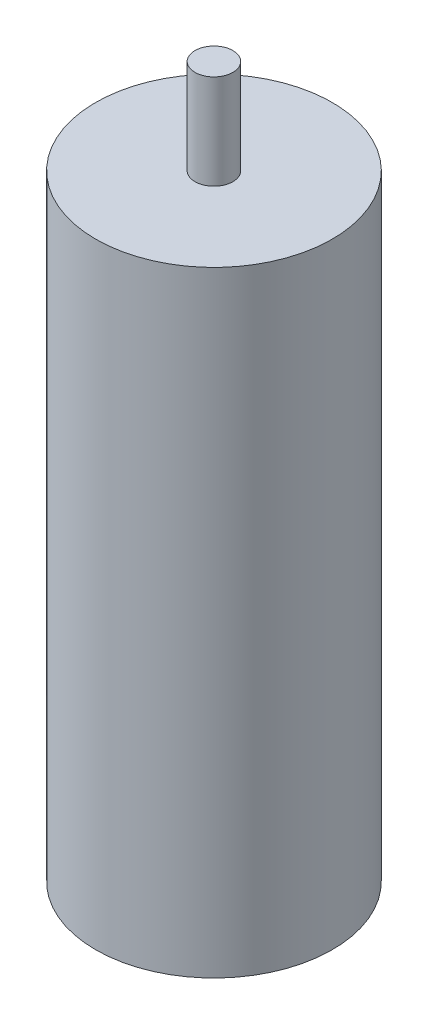
ISO-10303-21;
HEADER;
FILE_DESCRIPTION(('STEP AP214'),'2;1');
FILE_NAME('part.step','',(''),(''),'','','');
FILE_SCHEMA(('AUTOMOTIVE_DESIGN { 1 0 10303 214 1 1 1 1 }'));
ENDSEC;
DATA;
#1=APPLICATION_CONTEXT('core data for automotive mechanical design processes');
#2=APPLICATION_PROTOCOL_DEFINITION('international standard','automotive_design',2000,#1);
#3=PRODUCT_CONTEXT('',#1,'mechanical');
#4=PRODUCT('Part','Part','',(#3));
#5=PRODUCT_RELATED_PRODUCT_CATEGORY('part','',(#4));
#6=PRODUCT_DEFINITION_FORMATION('','',#4);
#7=PRODUCT_DEFINITION_CONTEXT('part definition',#1,'design');
#8=PRODUCT_DEFINITION('design','',#6,#7);
#9=PRODUCT_DEFINITION_SHAPE('','',#8);
#10=(LENGTH_UNIT() NAMED_UNIT(*) SI_UNIT(.MILLI.,.METRE.));
#11=(NAMED_UNIT(*) PLANE_ANGLE_UNIT() SI_UNIT($,.RADIAN.));
#12=(NAMED_UNIT(*) SI_UNIT($,.STERADIAN.) SOLID_ANGLE_UNIT());
#13=UNCERTAINTY_MEASURE_WITH_UNIT(LENGTH_MEASURE(1.E-05),#10,'distance_accuracy_value','');
#14=(GEOMETRIC_REPRESENTATION_CONTEXT(3) GLOBAL_UNCERTAINTY_ASSIGNED_CONTEXT((#13)) GLOBAL_UNIT_ASSIGNED_CONTEXT((#10,
#11,#12)) REPRESENTATION_CONTEXT('',''));
#15=CARTESIAN_POINT('',(0.,0.,0.));
#16=DIRECTION('',(0.,0.,1.));
#17=DIRECTION('',(1.,0.,0.));
#18=AXIS2_PLACEMENT_3D('',#15,#16,#17);
#19=CARTESIAN_POINT('',(0.,65.,0.));
#20=DIRECTION('',(0.,-1.,0.));
#21=DIRECTION('',(0.,0.,-1.));
#22=AXIS2_PLACEMENT_3D('',#19,#20,#21);
#23=CYLINDRICAL_SURFACE('',#22,12.5);
#24=CARTESIAN_POINT('',(0.,65.,0.));
#25=DIRECTION('',(0.,1.,0.));
#26=DIRECTION('',(0.,0.,1.));
#27=AXIS2_PLACEMENT_3D('',#24,#25,#26);
#28=CIRCLE('',#27,12.5);
#29=CARTESIAN_POINT('',(0.,65.,12.5));
#30=VERTEX_POINT('',#29);
#31=EDGE_CURVE('E44',#30,#30,#28,.T.);
#32=ORIENTED_EDGE('',*,*,#31,.F.);
#33=EDGE_LOOP('',(#32));
#34=FACE_BOUND('',#33,.T.);
#35=CARTESIAN_POINT('',(0.,0.,0.));
#36=DIRECTION('',(0.,1.,0.));
#37=DIRECTION('',(0.,0.,1.));
#38=AXIS2_PLACEMENT_3D('',#35,#36,#37);
#39=CIRCLE('',#38,12.5);
#40=CARTESIAN_POINT('',(0.,0.,12.5));
#41=VERTEX_POINT('',#40);
#42=EDGE_CURVE('E40',#41,#41,#39,.T.);
#43=ORIENTED_EDGE('',*,*,#42,.T.);
#44=EDGE_LOOP('',(#43));
#45=FACE_BOUND('',#44,.T.);
#46=ADVANCED_FACE('F37',(#34,#45),#23,.T.);
#47=CARTESIAN_POINT('',(0.,65.,0.));
#48=DIRECTION('',(0.,1.,0.));
#49=DIRECTION('',(0.,0.,1.));
#50=AXIS2_PLACEMENT_3D('',#47,#48,#49);
#51=PLANE('',#50);
#52=CARTESIAN_POINT('',(0.,65.,0.));
#53=DIRECTION('',(0.,1.,0.));
#54=DIRECTION('',(0.,0.,1.));
#55=AXIS2_PLACEMENT_3D('',#52,#53,#54);
#56=CIRCLE('',#55,2.);
#57=CARTESIAN_POINT('',(0.,65.,2.));
#58=VERTEX_POINT('',#57);
#59=EDGE_CURVE('E10',#58,#58,#56,.T.);
#60=ORIENTED_EDGE('',*,*,#59,.F.);
#61=EDGE_LOOP('',(#60));
#62=FACE_BOUND('',#61,.T.);
#63=ORIENTED_EDGE('',*,*,#31,.T.);
#64=EDGE_LOOP('',(#63));
#65=FACE_BOUND('',#64,.T.);
#66=ADVANCED_FACE('F61',(#62,#65),#51,.T.);
#67=CARTESIAN_POINT('',(0.,0.,0.));
#68=DIRECTION('',(0.,1.,0.));
#69=DIRECTION('',(0.,0.,1.));
#70=AXIS2_PLACEMENT_3D('',#67,#68,#69);
#71=PLANE('',#70);
#72=ORIENTED_EDGE('',*,*,#42,.F.);
#73=EDGE_LOOP('',(#72));
#74=FACE_BOUND('',#73,.T.);
#75=ADVANCED_FACE('F58',(#74),#71,.F.);
#76=CARTESIAN_POINT('',(0.,75.,0.));
#77=DIRECTION('',(0.,-1.,0.));
#78=DIRECTION('',(0.,0.,-1.));
#79=AXIS2_PLACEMENT_3D('',#76,#77,#78);
#80=CYLINDRICAL_SURFACE('',#79,2.);
#81=CARTESIAN_POINT('',(0.,75.,0.));
#82=DIRECTION('',(0.,1.,0.));
#83=DIRECTION('',(0.,0.,1.));
#84=AXIS2_PLACEMENT_3D('',#81,#82,#83);
#85=CIRCLE('',#84,2.);
#86=CARTESIAN_POINT('',(0.,75.,2.));
#87=VERTEX_POINT('',#86);
#88=EDGE_CURVE('E50',#87,#87,#85,.T.);
#89=ORIENTED_EDGE('',*,*,#88,.F.);
#90=EDGE_LOOP('',(#89));
#91=FACE_BOUND('',#90,.T.);
#92=ORIENTED_EDGE('',*,*,#59,.T.);
#93=EDGE_LOOP('',(#92));
#94=FACE_BOUND('',#93,.T.);
#95=ADVANCED_FACE('F60',(#91,#94),#80,.T.);
#96=CARTESIAN_POINT('',(0.,75.,0.));
#97=DIRECTION('',(0.,1.,0.));
#98=DIRECTION('',(0.,0.,1.));
#99=AXIS2_PLACEMENT_3D('',#96,#97,#98);
#100=PLANE('',#99);
#101=ORIENTED_EDGE('',*,*,#88,.T.);
#102=EDGE_LOOP('',(#101));
#103=FACE_BOUND('',#102,.T.);
#104=ADVANCED_FACE('F67',(#103),#100,.T.);
#105=CLOSED_SHELL('',(#46,#66,#75,#95,#104));
#106=MANIFOLD_SOLID_BREP('B2',#105);
#107=ADVANCED_BREP_SHAPE_REPRESENTATION('',(#18,#106),#14);
#108=SHAPE_DEFINITION_REPRESENTATION(#9,#107);
ENDSEC;
END-ISO-10303-21;
